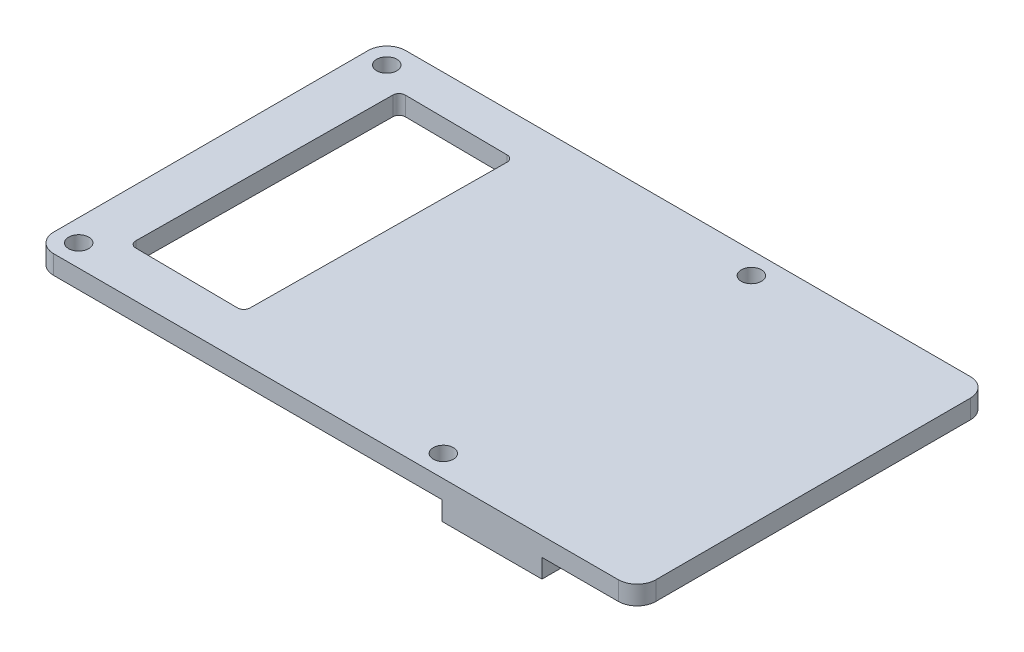
ISO-10303-21;
HEADER;
FILE_DESCRIPTION(('STEP AP214'),'2;1');
FILE_NAME('part.step','',(''),(''),'','','');
FILE_SCHEMA(('AUTOMOTIVE_DESIGN { 1 0 10303 214 1 1 1 1 }'));
ENDSEC;
DATA;
#1=APPLICATION_CONTEXT('core data for automotive mechanical design processes');
#2=APPLICATION_PROTOCOL_DEFINITION('international standard','automotive_design',2000,#1);
#3=PRODUCT_CONTEXT('',#1,'mechanical');
#4=PRODUCT('Part','Part','',(#3));
#5=PRODUCT_RELATED_PRODUCT_CATEGORY('part','',(#4));
#6=PRODUCT_DEFINITION_FORMATION('','',#4);
#7=PRODUCT_DEFINITION_CONTEXT('part definition',#1,'design');
#8=PRODUCT_DEFINITION('design','',#6,#7);
#9=PRODUCT_DEFINITION_SHAPE('','',#8);
#10=(LENGTH_UNIT() NAMED_UNIT(*) SI_UNIT(.MILLI.,.METRE.));
#11=(NAMED_UNIT(*) PLANE_ANGLE_UNIT() SI_UNIT($,.RADIAN.));
#12=(NAMED_UNIT(*) SI_UNIT($,.STERADIAN.) SOLID_ANGLE_UNIT());
#13=UNCERTAINTY_MEASURE_WITH_UNIT(LENGTH_MEASURE(1.E-05),#10,'distance_accuracy_value','');
#14=(GEOMETRIC_REPRESENTATION_CONTEXT(3) GLOBAL_UNCERTAINTY_ASSIGNED_CONTEXT((#13)) GLOBAL_UNIT_ASSIGNED_CONTEXT((#10,
#11,#12)) REPRESENTATION_CONTEXT('',''));
#15=CARTESIAN_POINT('',(0.,0.,0.));
#16=DIRECTION('',(0.,0.,1.));
#17=DIRECTION('',(1.,0.,0.));
#18=AXIS2_PLACEMENT_3D('',#15,#16,#17);
#19=CARTESIAN_POINT('',(-77.0217231267692,0.,-21.4026703774337));
#20=DIRECTION('',(0.,1.,0.));
#21=DIRECTION('',(0.,0.,1.));
#22=AXIS2_PLACEMENT_3D('',#19,#20,#21);
#23=PLANE('',#22);
#24=DIRECTION('',(0.,0.,-1.));
#25=VECTOR('',#24,1.);
#26=CARTESIAN_POINT('',(-15.2270796572365,0.,31.5917365313783));
#27=LINE('',#26,#25);
#28=CARTESIAN_POINT('',(-15.2270796572365,0.,31.5917365313783));
#29=VERTEX_POINT('',#28);
#30=CARTESIAN_POINT('',(-15.2270796572365,0.,-24.3899754320437));
#31=VERTEX_POINT('',#30);
#32=EDGE_CURVE('E202',#29,#31,#27,.T.);
#33=ORIENTED_EDGE('',*,*,#32,.F.);
#34=DIRECTION('',(1.,0.,0.));
#35=VECTOR('',#34,1.);
#36=CARTESIAN_POINT('',(-77.0217231267692,0.,31.5917365313783));
#37=LINE('',#36,#35);
#38=CARTESIAN_POINT('',(-77.0217231267692,0.,31.5917365313783));
#39=VERTEX_POINT('',#38);
#40=EDGE_CURVE('E367',#39,#29,#37,.T.);
#41=ORIENTED_EDGE('',*,*,#40,.F.);
#42=CARTESIAN_POINT('',(-77.0217231267692,0.,28.6044314767683));
#43=DIRECTION('',(0.,1.,0.));
#44=DIRECTION('',(0.,0.,1.));
#45=AXIS2_PLACEMENT_3D('',#42,#43,#44);
#46=CIRCLE('',#45,2.98730505460999);
#47=CARTESIAN_POINT('',(-80.0090281813792,0.,28.6044314767683));
#48=VERTEX_POINT('',#47);
#49=EDGE_CURVE('E364',#48,#39,#46,.T.);
#50=ORIENTED_EDGE('',*,*,#49,.F.);
#51=DIRECTION('',(0.,0.,1.));
#52=VECTOR('',#51,1.);
#53=CARTESIAN_POINT('',(-80.0090281813792,0.,-21.4026703774337));
#54=LINE('',#53,#52);
#55=CARTESIAN_POINT('',(-80.0090281813792,0.,-21.4026703774337));
#56=VERTEX_POINT('',#55);
#57=EDGE_CURVE('E362',#56,#48,#54,.T.);
#58=ORIENTED_EDGE('',*,*,#57,.F.);
#59=CARTESIAN_POINT('',(-77.0217231267692,0.,-21.4026703774337));
#60=DIRECTION('',(0.,1.,0.));
#61=DIRECTION('',(0.,0.,1.));
#62=AXIS2_PLACEMENT_3D('',#59,#60,#61);
#63=CIRCLE('',#62,2.98730505461);
#64=CARTESIAN_POINT('',(-77.0217231267692,0.,-24.3899754320437));
#65=VERTEX_POINT('',#64);
#66=EDGE_CURVE('E338',#65,#56,#63,.T.);
#67=ORIENTED_EDGE('',*,*,#66,.F.);
#68=DIRECTION('',(-1.,0.,0.));
#69=VECTOR('',#68,1.);
#70=CARTESIAN_POINT('',(12.7872583311938,0.,-24.3899754320437));
#71=LINE('',#70,#69);
#72=EDGE_CURVE('E376',#31,#65,#71,.T.);
#73=ORIENTED_EDGE('',*,*,#72,.F.);
#74=EDGE_LOOP('',(#33,#41,#50,#58,#67,#73));
#75=FACE_BOUND('',#74,.T.);
#76=CARTESIAN_POINT('',(-76.5283322199792,0.,28.1135297749583));
#77=DIRECTION('',(0.,1.,0.));
#78=DIRECTION('',(0.,0.,1.));
#79=AXIS2_PLACEMENT_3D('',#76,#77,#78);
#80=CIRCLE('',#79,1.6);
#81=CARTESIAN_POINT('',(-76.5283322199792,0.,29.7135297749583));
#82=VERTEX_POINT('',#81);
#83=EDGE_CURVE('E316',#82,#82,#80,.T.);
#84=ORIENTED_EDGE('',*,*,#83,.T.);
#85=EDGE_LOOP('',(#84));
#86=FACE_BOUND('',#85,.T.);
#87=CARTESIAN_POINT('',(-18.5283322199872,0.,28.1136567752183));
#88=DIRECTION('',(0.,1.,0.));
#89=DIRECTION('',(0.,0.,1.));
#90=AXIS2_PLACEMENT_3D('',#87,#88,#89);
#91=CIRCLE('',#90,1.6);
#92=CARTESIAN_POINT('',(-18.5283322199872,0.,29.7136567752183));
#93=VERTEX_POINT('',#92);
#94=EDGE_CURVE('E320',#93,#93,#91,.T.);
#95=ORIENTED_EDGE('',*,*,#94,.T.);
#96=EDGE_LOOP('',(#95));
#97=FACE_BOUND('',#96,.T.);
#98=CARTESIAN_POINT('',(-18.5285862204952,0.,-20.8865972252877));
#99=DIRECTION('',(0.,1.,0.));
#100=DIRECTION('',(0.,0.,1.));
#101=AXIS2_PLACEMENT_3D('',#98,#99,#100);
#102=CIRCLE('',#101,1.6);
#103=CARTESIAN_POINT('',(-18.5285862204952,0.,-19.2865972252877));
#104=VERTEX_POINT('',#103);
#105=EDGE_CURVE('E326',#104,#104,#102,.T.);
#106=ORIENTED_EDGE('',*,*,#105,.T.);
#107=EDGE_LOOP('',(#106));
#108=FACE_BOUND('',#107,.T.);
#109=CARTESIAN_POINT('',(-76.5284846202892,0.,-20.8867242255417));
#110=DIRECTION('',(0.,1.,0.));
#111=DIRECTION('',(0.,0.,1.));
#112=AXIS2_PLACEMENT_3D('',#109,#110,#111);
#113=CIRCLE('',#112,1.6);
#114=CARTESIAN_POINT('',(-76.5284846202892,0.,-19.2867242255417));
#115=VERTEX_POINT('',#114);
#116=EDGE_CURVE('E332',#115,#115,#113,.T.);
#117=ORIENTED_EDGE('',*,*,#116,.T.);
#118=EDGE_LOOP('',(#117));
#119=FACE_BOUND('',#118,.T.);
#120=CARTESIAN_POINT('',(-71.2794395148774,0.,23.2884633232575));
#121=DIRECTION('',(0.,1.,0.));
#122=DIRECTION('',(0.,0.,-1.));
#123=AXIS2_PLACEMENT_3D('',#120,#121,#122);
#124=CIRCLE('',#123,1.);
#125=CARTESIAN_POINT('',(-72.2793985022264,0.,23.2794066340148));
#126=VERTEX_POINT('',#125);
#127=CARTESIAN_POINT('',(-71.2884962041201,0.,24.2884223106065));
#128=VERTEX_POINT('',#127);
#129=EDGE_CURVE('E257',#126,#128,#124,.T.);
#130=ORIENTED_EDGE('',*,*,#129,.T.);
#131=DIRECTION('',(0.999958987348962,0.,0.00905668924269613));
#132=VECTOR('',#131,1.);
#133=CARTESIAN_POINT('',(-54.9495846601127,0.,24.4364048241797));
#134=LINE('',#133,#132);
#135=CARTESIAN_POINT('',(-54.9495846601127,0.,24.4364048241797));
#136=VERTEX_POINT('',#135);
#137=EDGE_CURVE('E279',#128,#136,#134,.T.);
#138=ORIENTED_EDGE('',*,*,#137,.T.);
#139=CARTESIAN_POINT('',(-54.94052797087,0.,23.4364458368307));
#140=DIRECTION('',(0.,1.,0.));
#141=DIRECTION('',(0.,0.,-1.));
#142=AXIS2_PLACEMENT_3D('',#139,#140,#141);
#143=CIRCLE('',#142,1.);
#144=CARTESIAN_POINT('',(-53.940568983521,0.,23.4455025260734));
#145=VERTEX_POINT('',#144);
#146=EDGE_CURVE('E282',#136,#145,#143,.T.);
#147=ORIENTED_EDGE('',*,*,#146,.T.);
#148=DIRECTION('',(0.00905668924269597,0.,-0.999958987348962));
#149=VECTOR('',#148,1.);
#150=CARTESIAN_POINT('',(-53.5735878673821,0.,-17.0732847963952));
#151=LINE('',#150,#149);
#152=CARTESIAN_POINT('',(-53.5735878673821,0.,-17.0732847963952));
#153=VERTEX_POINT('',#152);
#154=EDGE_CURVE('E285',#145,#153,#151,.T.);
#155=ORIENTED_EDGE('',*,*,#154,.T.);
#156=CARTESIAN_POINT('',(-54.573546854731,0.,-17.0823414856379));
#157=DIRECTION('',(0.,1.,0.));
#158=DIRECTION('',(0.,0.,1.));
#159=AXIS2_PLACEMENT_3D('',#156,#157,#158);
#160=CIRCLE('',#159,1.);
#161=CARTESIAN_POINT('',(-54.5644901654883,0.,-18.0823004729869));
#162=VERTEX_POINT('',#161);
#163=EDGE_CURVE('E288',#153,#162,#160,.T.);
#164=ORIENTED_EDGE('',*,*,#163,.T.);
#165=DIRECTION('',(-0.999958987348962,0.,-0.00905668924269613));
#166=VECTOR('',#165,1.);
#167=CARTESIAN_POINT('',(-70.9034017094957,0.,-18.2302829865601));
#168=LINE('',#167,#166);
#169=CARTESIAN_POINT('',(-70.9034017094957,0.,-18.2302829865601));
#170=VERTEX_POINT('',#169);
#171=EDGE_CURVE('E291',#162,#170,#168,.T.);
#172=ORIENTED_EDGE('',*,*,#171,.T.);
#173=CARTESIAN_POINT('',(-70.9124583987385,0.,-17.2303239992111));
#174=DIRECTION('',(0.,1.,0.));
#175=DIRECTION('',(0.,0.,1.));
#176=AXIS2_PLACEMENT_3D('',#173,#174,#175);
#177=CIRCLE('',#176,1.);
#178=CARTESIAN_POINT('',(-71.9124173860874,0.,-17.2393806884538));
#179=VERTEX_POINT('',#178);
#180=EDGE_CURVE('E294',#170,#179,#177,.T.);
#181=ORIENTED_EDGE('',*,*,#180,.T.);
#182=DIRECTION('',(-0.00905668924269614,0.,0.999958987348962));
#183=VECTOR('',#182,1.);
#184=CARTESIAN_POINT('',(-71.9124173860874,0.,-17.2393806884538));
#185=LINE('',#184,#183);
#186=EDGE_CURVE('E261',#179,#126,#185,.T.);
#187=ORIENTED_EDGE('',*,*,#186,.T.);
#188=EDGE_LOOP('',(#130,#138,#147,#155,#164,#172,#181,#187));
#189=FACE_BOUND('',#188,.T.);
#190=DIRECTION('',(0.,0.,-1.));
#191=VECTOR('',#190,1.);
#192=CARTESIAN_POINT('',(-36.8658082511568,0.,-15.5140581594289));
#193=LINE('',#192,#191);
#194=CARTESIAN_POINT('',(-36.8658082511568,0.,23.3522240061959));
#195=VERTEX_POINT('',#194);
#196=CARTESIAN_POINT('',(-36.8658082511568,0.,-15.5140581594289));
#197=VERTEX_POINT('',#196);
#198=EDGE_CURVE('E196',#195,#197,#193,.T.);
#199=ORIENTED_EDGE('',*,*,#198,.F.);
#200=DIRECTION('',(-1.,0.,0.));
#201=VECTOR('',#200,1.);
#202=CARTESIAN_POINT('',(-36.8658082511568,0.,23.3522240061959));
#203=LINE('',#202,#201);
#204=CARTESIAN_POINT('',(-24.844103821422,0.,23.3522240061959));
#205=VERTEX_POINT('',#204);
#206=EDGE_CURVE('E198',#205,#195,#203,.T.);
#207=ORIENTED_EDGE('',*,*,#206,.F.);
#208=DIRECTION('',(0.,0.,1.));
#209=VECTOR('',#208,1.);
#210=CARTESIAN_POINT('',(-24.844103821422,0.,-15.5140581594289));
#211=LINE('',#210,#209);
#212=CARTESIAN_POINT('',(-24.844103821422,0.,-15.5140581594289));
#213=VERTEX_POINT('',#212);
#214=EDGE_CURVE('E59',#213,#205,#211,.T.);
#215=ORIENTED_EDGE('',*,*,#214,.F.);
#216=DIRECTION('',(1.,0.,0.));
#217=VECTOR('',#216,1.);
#218=CARTESIAN_POINT('',(-36.8658082511568,0.,-15.5140581594289));
#219=LINE('',#218,#217);
#220=EDGE_CURVE('E54',#197,#213,#219,.T.);
#221=ORIENTED_EDGE('',*,*,#220,.F.);
#222=EDGE_LOOP('',(#199,#207,#215,#221));
#223=FACE_BOUND('',#222,.T.);
#224=ADVANCED_FACE('F39',(#75,#86,#97,#108,#119,#189,#223),#23,.F.);
#225=DIRECTION('',(0.,0.,1.));
#226=VECTOR('',#225,1.);
#227=CARTESIAN_POINT('',(0.63931518556087,0.,31.5917365313783));
#228=LINE('',#227,#226);
#229=CARTESIAN_POINT('',(0.639315185560874,0.,-24.3899754320437));
#230=VERTEX_POINT('',#229);
#231=CARTESIAN_POINT('',(0.63931518556087,0.,31.5917365313783));
#232=VERTEX_POINT('',#231);
#233=EDGE_CURVE('E235',#230,#232,#228,.T.);
#234=ORIENTED_EDGE('',*,*,#233,.F.);
#235=CARTESIAN_POINT('',(12.7872583311938,0.,-24.3899754320437));
#236=VERTEX_POINT('',#235);
#237=EDGE_CURVE('E345',#236,#230,#71,.T.);
#238=ORIENTED_EDGE('',*,*,#237,.F.);
#239=CARTESIAN_POINT('',(12.7872583311938,0.,-21.4026703774337));
#240=DIRECTION('',(0.,1.,0.));
#241=DIRECTION('',(0.,0.,1.));
#242=AXIS2_PLACEMENT_3D('',#239,#240,#241);
#243=CIRCLE('',#242,2.98730505461001);
#244=CARTESIAN_POINT('',(15.7745633858038,0.,-21.4026703774337));
#245=VERTEX_POINT('',#244);
#246=EDGE_CURVE('E374',#245,#236,#243,.T.);
#247=ORIENTED_EDGE('',*,*,#246,.F.);
#248=DIRECTION('',(0.,0.,-1.));
#249=VECTOR('',#248,1.);
#250=CARTESIAN_POINT('',(15.7745633858038,0.,28.6044314767683));
#251=LINE('',#250,#249);
#252=CARTESIAN_POINT('',(15.7745633858038,0.,28.6044314767683));
#253=VERTEX_POINT('',#252);
#254=EDGE_CURVE('E372',#253,#245,#251,.T.);
#255=ORIENTED_EDGE('',*,*,#254,.F.);
#256=CARTESIAN_POINT('',(12.7872583311938,0.,28.6044314767683));
#257=DIRECTION('',(0.,1.,0.));
#258=DIRECTION('',(0.,0.,1.));
#259=AXIS2_PLACEMENT_3D('',#256,#257,#258);
#260=CIRCLE('',#259,2.98730505461);
#261=CARTESIAN_POINT('',(12.7872583311938,0.,31.5917365313783));
#262=VERTEX_POINT('',#261);
#263=EDGE_CURVE('E370',#262,#253,#260,.T.);
#264=ORIENTED_EDGE('',*,*,#263,.F.);
#265=EDGE_CURVE('E366',#232,#262,#37,.T.);
#266=ORIENTED_EDGE('',*,*,#265,.F.);
#267=EDGE_LOOP('',(#234,#238,#247,#255,#264,#266));
#268=FACE_BOUND('',#267,.T.);
#269=ADVANCED_FACE('F426',(#268),#23,.F.);
#270=CARTESIAN_POINT('',(-77.0217231267692,3.,-21.4026703774337));
#271=DIRECTION('',(0.,1.,0.));
#272=DIRECTION('',(0.,0.,1.));
#273=AXIS2_PLACEMENT_3D('',#270,#271,#272);
#274=PLANE('',#273);
#275=CARTESIAN_POINT('',(-18.5283322199872,3.,28.1136567752183));
#276=DIRECTION('',(0.,1.,0.));
#277=DIRECTION('',(0.,0.,1.));
#278=AXIS2_PLACEMENT_3D('',#275,#276,#277);
#279=CIRCLE('',#278,1.6);
#280=CARTESIAN_POINT('',(-18.5283322199872,3.,29.7136567752183));
#281=VERTEX_POINT('',#280);
#282=EDGE_CURVE('E323',#281,#281,#279,.T.);
#283=ORIENTED_EDGE('',*,*,#282,.F.);
#284=EDGE_LOOP('',(#283));
#285=FACE_BOUND('',#284,.T.);
#286=CARTESIAN_POINT('',(-76.5284846202892,3.,-20.8867242255417));
#287=DIRECTION('',(0.,1.,0.));
#288=DIRECTION('',(0.,0.,1.));
#289=AXIS2_PLACEMENT_3D('',#286,#287,#288);
#290=CIRCLE('',#289,1.6);
#291=CARTESIAN_POINT('',(-76.5284846202892,3.,-19.2867242255417));
#292=VERTEX_POINT('',#291);
#293=EDGE_CURVE('E335',#292,#292,#290,.T.);
#294=ORIENTED_EDGE('',*,*,#293,.F.);
#295=EDGE_LOOP('',(#294));
#296=FACE_BOUND('',#295,.T.);
#297=CARTESIAN_POINT('',(-77.0217231267692,3.,-21.4026703774337));
#298=DIRECTION('',(0.,1.,0.));
#299=DIRECTION('',(0.,0.,1.));
#300=AXIS2_PLACEMENT_3D('',#297,#298,#299);
#301=CIRCLE('',#300,2.98730505461);
#302=CARTESIAN_POINT('',(-77.0217231267692,3.,-24.3899754320437));
#303=VERTEX_POINT('',#302);
#304=CARTESIAN_POINT('',(-80.0090281813792,3.,-21.4026703774337));
#305=VERTEX_POINT('',#304);
#306=EDGE_CURVE('E341',#303,#305,#301,.T.);
#307=ORIENTED_EDGE('',*,*,#306,.T.);
#308=DIRECTION('',(0.,0.,1.));
#309=VECTOR('',#308,1.);
#310=CARTESIAN_POINT('',(-80.0090281813792,3.,-21.4026703774337));
#311=LINE('',#310,#309);
#312=CARTESIAN_POINT('',(-80.0090281813792,3.,28.6044314767683));
#313=VERTEX_POINT('',#312);
#314=EDGE_CURVE('E344',#305,#313,#311,.T.);
#315=ORIENTED_EDGE('',*,*,#314,.T.);
#316=CARTESIAN_POINT('',(-77.0217231267692,3.,28.6044314767683));
#317=DIRECTION('',(0.,1.,0.));
#318=DIRECTION('',(0.,0.,1.));
#319=AXIS2_PLACEMENT_3D('',#316,#317,#318);
#320=CIRCLE('',#319,2.98730505460999);
#321=CARTESIAN_POINT('',(-77.0217231267692,3.,31.5917365313783));
#322=VERTEX_POINT('',#321);
#323=EDGE_CURVE('E347',#313,#322,#320,.T.);
#324=ORIENTED_EDGE('',*,*,#323,.T.);
#325=DIRECTION('',(1.,0.,0.));
#326=VECTOR('',#325,1.);
#327=CARTESIAN_POINT('',(-77.0217231267692,3.,31.5917365313783));
#328=LINE('',#327,#326);
#329=CARTESIAN_POINT('',(12.7872583311938,3.,31.5917365313783));
#330=VERTEX_POINT('',#329);
#331=EDGE_CURVE('E349',#322,#330,#328,.T.);
#332=ORIENTED_EDGE('',*,*,#331,.T.);
#333=CARTESIAN_POINT('',(12.7872583311938,3.,28.6044314767683));
#334=DIRECTION('',(0.,1.,0.));
#335=DIRECTION('',(0.,0.,1.));
#336=AXIS2_PLACEMENT_3D('',#333,#334,#335);
#337=CIRCLE('',#336,2.98730505461);
#338=CARTESIAN_POINT('',(15.7745633858038,3.,28.6044314767683));
#339=VERTEX_POINT('',#338);
#340=EDGE_CURVE('E351',#330,#339,#337,.T.);
#341=ORIENTED_EDGE('',*,*,#340,.T.);
#342=DIRECTION('',(0.,0.,-1.));
#343=VECTOR('',#342,1.);
#344=CARTESIAN_POINT('',(15.7745633858038,3.,28.6044314767683));
#345=LINE('',#344,#343);
#346=CARTESIAN_POINT('',(15.7745633858038,3.,-21.4026703774337));
#347=VERTEX_POINT('',#346);
#348=EDGE_CURVE('E353',#339,#347,#345,.T.);
#349=ORIENTED_EDGE('',*,*,#348,.T.);
#350=CARTESIAN_POINT('',(12.7872583311938,3.,-21.4026703774337));
#351=DIRECTION('',(0.,1.,0.));
#352=DIRECTION('',(0.,0.,1.));
#353=AXIS2_PLACEMENT_3D('',#350,#351,#352);
#354=CIRCLE('',#353,2.98730505461001);
#355=CARTESIAN_POINT('',(12.7872583311938,3.,-24.3899754320437));
#356=VERTEX_POINT('',#355);
#357=EDGE_CURVE('E355',#347,#356,#354,.T.);
#358=ORIENTED_EDGE('',*,*,#357,.T.);
#359=DIRECTION('',(-1.,0.,0.));
#360=VECTOR('',#359,1.);
#361=CARTESIAN_POINT('',(12.7872583311938,3.,-24.3899754320437));
#362=LINE('',#361,#360);
#363=EDGE_CURVE('E357',#356,#303,#362,.T.);
#364=ORIENTED_EDGE('',*,*,#363,.T.);
#365=EDGE_LOOP('',(#307,#315,#324,#332,#341,#349,#358,#364));
#366=FACE_BOUND('',#365,.T.);
#367=CARTESIAN_POINT('',(-18.5285862204952,3.,-20.8865972252877));
#368=DIRECTION('',(0.,1.,0.));
#369=DIRECTION('',(0.,0.,1.));
#370=AXIS2_PLACEMENT_3D('',#367,#368,#369);
#371=CIRCLE('',#370,1.6);
#372=CARTESIAN_POINT('',(-18.5285862204952,3.,-19.2865972252877));
#373=VERTEX_POINT('',#372);
#374=EDGE_CURVE('E329',#373,#373,#371,.T.);
#375=ORIENTED_EDGE('',*,*,#374,.F.);
#376=EDGE_LOOP('',(#375));
#377=FACE_BOUND('',#376,.T.);
#378=CARTESIAN_POINT('',(-76.5283322199792,3.,28.1135297749583));
#379=DIRECTION('',(0.,1.,0.));
#380=DIRECTION('',(0.,0.,1.));
#381=AXIS2_PLACEMENT_3D('',#378,#379,#380);
#382=CIRCLE('',#381,1.6);
#383=CARTESIAN_POINT('',(-76.5283322199792,3.,29.7135297749583));
#384=VERTEX_POINT('',#383);
#385=EDGE_CURVE('E317',#384,#384,#382,.T.);
#386=ORIENTED_EDGE('',*,*,#385,.F.);
#387=EDGE_LOOP('',(#386));
#388=FACE_BOUND('',#387,.T.);
#389=DIRECTION('',(0.999958987348962,0.,0.00905668924269613));
#390=VECTOR('',#389,1.);
#391=CARTESIAN_POINT('',(-54.9495846601127,3.,24.4364048241797));
#392=LINE('',#391,#390);
#393=CARTESIAN_POINT('',(-71.2884962041201,3.,24.2884223106065));
#394=VERTEX_POINT('',#393);
#395=CARTESIAN_POINT('',(-54.9495846601127,3.,24.4364048241797));
#396=VERTEX_POINT('',#395);
#397=EDGE_CURVE('E260',#394,#396,#392,.T.);
#398=ORIENTED_EDGE('',*,*,#397,.F.);
#399=CARTESIAN_POINT('',(-71.2794395148774,3.,23.2884633232575));
#400=DIRECTION('',(0.,1.,0.));
#401=DIRECTION('',(0.,0.,-1.));
#402=AXIS2_PLACEMENT_3D('',#399,#400,#401);
#403=CIRCLE('',#402,1.);
#404=CARTESIAN_POINT('',(-72.2793985022264,3.,23.2794066340148));
#405=VERTEX_POINT('',#404);
#406=EDGE_CURVE('E258',#405,#394,#403,.T.);
#407=ORIENTED_EDGE('',*,*,#406,.F.);
#408=DIRECTION('',(-0.00905668924269614,0.,0.999958987348962));
#409=VECTOR('',#408,1.);
#410=CARTESIAN_POINT('',(-71.9124173860874,3.,-17.2393806884538));
#411=LINE('',#410,#409);
#412=CARTESIAN_POINT('',(-71.9124173860874,3.,-17.2393806884538));
#413=VERTEX_POINT('',#412);
#414=EDGE_CURVE('E274',#413,#405,#411,.T.);
#415=ORIENTED_EDGE('',*,*,#414,.F.);
#416=CARTESIAN_POINT('',(-70.9124583987385,3.,-17.2303239992111));
#417=DIRECTION('',(0.,1.,0.));
#418=DIRECTION('',(0.,0.,1.));
#419=AXIS2_PLACEMENT_3D('',#416,#417,#418);
#420=CIRCLE('',#419,1.);
#421=CARTESIAN_POINT('',(-70.9034017094957,3.,-18.2302829865601));
#422=VERTEX_POINT('',#421);
#423=EDGE_CURVE('E271',#422,#413,#420,.T.);
#424=ORIENTED_EDGE('',*,*,#423,.F.);
#425=DIRECTION('',(-0.999958987348962,0.,-0.00905668924269613));
#426=VECTOR('',#425,1.);
#427=CARTESIAN_POINT('',(-70.9034017094957,3.,-18.2302829865601));
#428=LINE('',#427,#426);
#429=CARTESIAN_POINT('',(-54.5644901654883,3.,-18.0823004729869));
#430=VERTEX_POINT('',#429);
#431=EDGE_CURVE('E269',#430,#422,#428,.T.);
#432=ORIENTED_EDGE('',*,*,#431,.F.);
#433=CARTESIAN_POINT('',(-54.573546854731,3.,-17.0823414856379));
#434=DIRECTION('',(0.,1.,0.));
#435=DIRECTION('',(0.,0.,1.));
#436=AXIS2_PLACEMENT_3D('',#433,#434,#435);
#437=CIRCLE('',#436,1.);
#438=CARTESIAN_POINT('',(-53.5735878673821,3.,-17.0732847963952));
#439=VERTEX_POINT('',#438);
#440=EDGE_CURVE('E267',#439,#430,#437,.T.);
#441=ORIENTED_EDGE('',*,*,#440,.F.);
#442=DIRECTION('',(0.00905668924269597,0.,-0.999958987348962));
#443=VECTOR('',#442,1.);
#444=CARTESIAN_POINT('',(-53.5735878673821,3.,-17.0732847963952));
#445=LINE('',#444,#443);
#446=CARTESIAN_POINT('',(-53.940568983521,3.,23.4455025260734));
#447=VERTEX_POINT('',#446);
#448=EDGE_CURVE('E265',#447,#439,#445,.T.);
#449=ORIENTED_EDGE('',*,*,#448,.F.);
#450=CARTESIAN_POINT('',(-54.94052797087,3.,23.4364458368307));
#451=DIRECTION('',(0.,1.,0.));
#452=DIRECTION('',(0.,0.,-1.));
#453=AXIS2_PLACEMENT_3D('',#450,#451,#452);
#454=CIRCLE('',#453,1.);
#455=EDGE_CURVE('E263',#396,#447,#454,.T.);
#456=ORIENTED_EDGE('',*,*,#455,.F.);
#457=EDGE_LOOP('',(#398,#407,#415,#424,#432,#441,#449,#456));
#458=FACE_BOUND('',#457,.T.);
#459=ADVANCED_FACE('F447',(#285,#296,#366,#377,#388,#458),#274,.T.);
#460=CARTESIAN_POINT('',(-77.0217231267692,3.,-21.4026703774337));
#461=DIRECTION('',(0.,-1.,0.));
#462=DIRECTION('',(0.,0.,-1.));
#463=AXIS2_PLACEMENT_3D('',#460,#461,#462);
#464=CYLINDRICAL_SURFACE('',#463,2.98730505461);
#465=ORIENTED_EDGE('',*,*,#66,.T.);
#466=DIRECTION('',(0.,-1.,0.));
#467=VECTOR('',#466,1.);
#468=CARTESIAN_POINT('',(-80.0090281813792,3.,-21.4026703774337));
#469=LINE('',#468,#467);
#470=EDGE_CURVE('E11',#305,#56,#469,.T.);
#471=ORIENTED_EDGE('',*,*,#470,.F.);
#472=ORIENTED_EDGE('',*,*,#306,.F.);
#473=DIRECTION('',(0.,-1.,0.));
#474=VECTOR('',#473,1.);
#475=CARTESIAN_POINT('',(-77.0217231267692,3.,-24.3899754320437));
#476=LINE('',#475,#474);
#477=EDGE_CURVE('E359',#303,#65,#476,.T.);
#478=ORIENTED_EDGE('',*,*,#477,.T.);
#479=EDGE_LOOP('',(#465,#471,#472,#478));
#480=FACE_BOUND('',#479,.T.);
#481=ADVANCED_FACE('F41',(#480),#464,.T.);
#482=CARTESIAN_POINT('',(-80.0090281813792,3.,-21.4026703774337));
#483=DIRECTION('',(1.,0.,0.));
#484=DIRECTION('',(0.,0.,-1.));
#485=AXIS2_PLACEMENT_3D('',#482,#483,#484);
#486=PLANE('',#485);
#487=ORIENTED_EDGE('',*,*,#57,.T.);
#488=DIRECTION('',(0.,-1.,0.));
#489=VECTOR('',#488,1.);
#490=CARTESIAN_POINT('',(-80.0090281813792,3.,28.6044314767683));
#491=LINE('',#490,#489);
#492=EDGE_CURVE('E47',#313,#48,#491,.T.);
#493=ORIENTED_EDGE('',*,*,#492,.F.);
#494=ORIENTED_EDGE('',*,*,#314,.F.);
#495=ORIENTED_EDGE('',*,*,#470,.T.);
#496=EDGE_LOOP('',(#487,#493,#494,#495));
#497=FACE_BOUND('',#496,.T.);
#498=ADVANCED_FACE('F451',(#497),#486,.F.);
#499=CARTESIAN_POINT('',(-77.0217231267692,3.,28.6044314767683));
#500=DIRECTION('',(0.,-1.,0.));
#501=DIRECTION('',(0.,0.,-1.));
#502=AXIS2_PLACEMENT_3D('',#499,#500,#501);
#503=CYLINDRICAL_SURFACE('',#502,2.98730505460999);
#504=ORIENTED_EDGE('',*,*,#49,.T.);
#505=DIRECTION('',(0.,-1.,0.));
#506=VECTOR('',#505,1.);
#507=CARTESIAN_POINT('',(-77.0217231267692,3.,31.5917365313783));
#508=LINE('',#507,#506);
#509=EDGE_CURVE('E393',#322,#39,#508,.T.);
#510=ORIENTED_EDGE('',*,*,#509,.F.);
#511=ORIENTED_EDGE('',*,*,#323,.F.);
#512=ORIENTED_EDGE('',*,*,#492,.T.);
#513=EDGE_LOOP('',(#504,#510,#511,#512));
#514=FACE_BOUND('',#513,.T.);
#515=ADVANCED_FACE('F400',(#514),#503,.T.);
#516=CARTESIAN_POINT('',(-77.0217231267692,3.,31.5917365313783));
#517=DIRECTION('',(0.,0.,-1.));
#518=DIRECTION('',(-1.,0.,0.));
#519=AXIS2_PLACEMENT_3D('',#516,#517,#518);
#520=PLANE('',#519);
#521=ORIENTED_EDGE('',*,*,#40,.T.);
#522=DIRECTION('',(0.,1.,0.));
#523=VECTOR('',#522,1.);
#524=CARTESIAN_POINT('',(-15.2270796572365,-3.,31.5917365313783));
#525=LINE('',#524,#523);
#526=CARTESIAN_POINT('',(-15.2270796572365,-3.,31.5917365313783));
#527=VERTEX_POINT('',#526);
#528=EDGE_CURVE('E241',#527,#29,#525,.T.);
#529=ORIENTED_EDGE('',*,*,#528,.F.);
#530=DIRECTION('',(-1.,0.,0.));
#531=VECTOR('',#530,1.);
#532=CARTESIAN_POINT('',(-15.2270796572365,-3.,31.5917365313783));
#533=LINE('',#532,#531);
#534=CARTESIAN_POINT('',(0.63931518556087,-3.,31.5917365313783));
#535=VERTEX_POINT('',#534);
#536=EDGE_CURVE('E239',#535,#527,#533,.T.);
#537=ORIENTED_EDGE('',*,*,#536,.F.);
#538=DIRECTION('',(0.,1.,0.));
#539=VECTOR('',#538,1.);
#540=CARTESIAN_POINT('',(0.63931518556087,-3.,31.5917365313783));
#541=LINE('',#540,#539);
#542=EDGE_CURVE('E248',#535,#232,#541,.T.);
#543=ORIENTED_EDGE('',*,*,#542,.T.);
#544=ORIENTED_EDGE('',*,*,#265,.T.);
#545=DIRECTION('',(0.,-1.,0.));
#546=VECTOR('',#545,1.);
#547=CARTESIAN_POINT('',(12.7872583311938,3.,31.5917365313783));
#548=LINE('',#547,#546);
#549=EDGE_CURVE('E390',#330,#262,#548,.T.);
#550=ORIENTED_EDGE('',*,*,#549,.F.);
#551=ORIENTED_EDGE('',*,*,#331,.F.);
#552=ORIENTED_EDGE('',*,*,#509,.T.);
#553=EDGE_LOOP('',(#521,#529,#537,#543,#544,#550,#551,#552));
#554=FACE_BOUND('',#553,.T.);
#555=ADVANCED_FACE('F409',(#554),#520,.F.);
#556=CARTESIAN_POINT('',(12.7872583311938,3.,28.6044314767683));
#557=DIRECTION('',(0.,-1.,0.));
#558=DIRECTION('',(0.,0.,-1.));
#559=AXIS2_PLACEMENT_3D('',#556,#557,#558);
#560=CYLINDRICAL_SURFACE('',#559,2.98730505461);
#561=ORIENTED_EDGE('',*,*,#263,.T.);
#562=DIRECTION('',(0.,-1.,0.));
#563=VECTOR('',#562,1.);
#564=CARTESIAN_POINT('',(15.7745633858038,3.,28.6044314767683));
#565=LINE('',#564,#563);
#566=EDGE_CURVE('E387',#339,#253,#565,.T.);
#567=ORIENTED_EDGE('',*,*,#566,.F.);
#568=ORIENTED_EDGE('',*,*,#340,.F.);
#569=ORIENTED_EDGE('',*,*,#549,.T.);
#570=EDGE_LOOP('',(#561,#567,#568,#569));
#571=FACE_BOUND('',#570,.T.);
#572=ADVANCED_FACE('F445',(#571),#560,.T.);
#573=CARTESIAN_POINT('',(15.7745633858038,3.,28.6044314767683));
#574=DIRECTION('',(-1.,0.,0.));
#575=DIRECTION('',(0.,0.,1.));
#576=AXIS2_PLACEMENT_3D('',#573,#574,#575);
#577=PLANE('',#576);
#578=ORIENTED_EDGE('',*,*,#254,.T.);
#579=DIRECTION('',(0.,-1.,0.));
#580=VECTOR('',#579,1.);
#581=CARTESIAN_POINT('',(15.7745633858038,3.,-21.4026703774337));
#582=LINE('',#581,#580);
#583=EDGE_CURVE('E384',#347,#245,#582,.T.);
#584=ORIENTED_EDGE('',*,*,#583,.F.);
#585=ORIENTED_EDGE('',*,*,#348,.F.);
#586=ORIENTED_EDGE('',*,*,#566,.T.);
#587=EDGE_LOOP('',(#578,#584,#585,#586));
#588=FACE_BOUND('',#587,.T.);
#589=ADVANCED_FACE('F440',(#588),#577,.F.);
#590=CARTESIAN_POINT('',(12.7872583311938,3.,-21.4026703774337));
#591=DIRECTION('',(0.,-1.,0.));
#592=DIRECTION('',(0.,0.,-1.));
#593=AXIS2_PLACEMENT_3D('',#590,#591,#592);
#594=CYLINDRICAL_SURFACE('',#593,2.98730505461001);
#595=ORIENTED_EDGE('',*,*,#246,.T.);
#596=DIRECTION('',(0.,-1.,0.));
#597=VECTOR('',#596,1.);
#598=CARTESIAN_POINT('',(12.7872583311938,3.,-24.3899754320437));
#599=LINE('',#598,#597);
#600=EDGE_CURVE('E381',#356,#236,#599,.T.);
#601=ORIENTED_EDGE('',*,*,#600,.F.);
#602=ORIENTED_EDGE('',*,*,#357,.F.);
#603=ORIENTED_EDGE('',*,*,#583,.T.);
#604=EDGE_LOOP('',(#595,#601,#602,#603));
#605=FACE_BOUND('',#604,.T.);
#606=ADVANCED_FACE('F436',(#605),#594,.T.);
#607=CARTESIAN_POINT('',(12.7872583311938,3.,-24.3899754320437));
#608=DIRECTION('',(0.,0.,1.));
#609=DIRECTION('',(1.,0.,0.));
#610=AXIS2_PLACEMENT_3D('',#607,#608,#609);
#611=PLANE('',#610);
#612=ORIENTED_EDGE('',*,*,#237,.T.);
#613=DIRECTION('',(0.,1.,0.));
#614=VECTOR('',#613,1.);
#615=CARTESIAN_POINT('',(0.639315185560877,-3.,-24.3899754320437));
#616=LINE('',#615,#614);
#617=CARTESIAN_POINT('',(0.639315185560877,-3.,-24.3899754320437));
#618=VERTEX_POINT('',#617);
#619=EDGE_CURVE('E251',#618,#230,#616,.T.);
#620=ORIENTED_EDGE('',*,*,#619,.F.);
#621=DIRECTION('',(1.,0.,0.));
#622=VECTOR('',#621,1.);
#623=CARTESIAN_POINT('',(-15.2270796572365,-3.,-24.3899754320437));
#624=LINE('',#623,#622);
#625=CARTESIAN_POINT('',(-15.2270796572365,-3.,-24.3899754320437));
#626=VERTEX_POINT('',#625);
#627=EDGE_CURVE('E234',#626,#618,#624,.T.);
#628=ORIENTED_EDGE('',*,*,#627,.F.);
#629=DIRECTION('',(0.,1.,0.));
#630=VECTOR('',#629,1.);
#631=CARTESIAN_POINT('',(-15.2270796572365,-3.,-24.3899754320437));
#632=LINE('',#631,#630);
#633=EDGE_CURVE('E254',#626,#31,#632,.T.);
#634=ORIENTED_EDGE('',*,*,#633,.T.);
#635=ORIENTED_EDGE('',*,*,#72,.T.);
#636=ORIENTED_EDGE('',*,*,#477,.F.);
#637=ORIENTED_EDGE('',*,*,#363,.F.);
#638=ORIENTED_EDGE('',*,*,#600,.T.);
#639=EDGE_LOOP('',(#612,#620,#628,#634,#635,#636,#637,#638));
#640=FACE_BOUND('',#639,.T.);
#641=ADVANCED_FACE('F430',(#640),#611,.F.);
#642=CARTESIAN_POINT('',(-76.5284846202892,3.,-20.8867242255417));
#643=DIRECTION('',(0.,-1.,0.));
#644=DIRECTION('',(0.,0.,-1.));
#645=AXIS2_PLACEMENT_3D('',#642,#643,#644);
#646=CYLINDRICAL_SURFACE('',#645,1.6);
#647=ORIENTED_EDGE('',*,*,#293,.T.);
#648=EDGE_LOOP('',(#647));
#649=FACE_BOUND('',#648,.T.);
#650=ORIENTED_EDGE('',*,*,#116,.F.);
#651=EDGE_LOOP('',(#650));
#652=FACE_BOUND('',#651,.T.);
#653=ADVANCED_FACE('F469',(#649,#652),#646,.F.);
#654=CARTESIAN_POINT('',(-18.5285862204952,3.,-20.8865972252877));
#655=DIRECTION('',(0.,-1.,0.));
#656=DIRECTION('',(0.,0.,-1.));
#657=AXIS2_PLACEMENT_3D('',#654,#655,#656);
#658=CYLINDRICAL_SURFACE('',#657,1.6);
#659=ORIENTED_EDGE('',*,*,#374,.T.);
#660=EDGE_LOOP('',(#659));
#661=FACE_BOUND('',#660,.T.);
#662=ORIENTED_EDGE('',*,*,#105,.F.);
#663=EDGE_LOOP('',(#662));
#664=FACE_BOUND('',#663,.T.);
#665=ADVANCED_FACE('F511',(#661,#664),#658,.F.);
#666=CARTESIAN_POINT('',(-18.5283322199872,3.,28.1136567752183));
#667=DIRECTION('',(0.,-1.,0.));
#668=DIRECTION('',(0.,0.,-1.));
#669=AXIS2_PLACEMENT_3D('',#666,#667,#668);
#670=CYLINDRICAL_SURFACE('',#669,1.6);
#671=ORIENTED_EDGE('',*,*,#282,.T.);
#672=EDGE_LOOP('',(#671));
#673=FACE_BOUND('',#672,.T.);
#674=ORIENTED_EDGE('',*,*,#94,.F.);
#675=EDGE_LOOP('',(#674));
#676=FACE_BOUND('',#675,.T.);
#677=ADVANCED_FACE('F518',(#673,#676),#670,.F.);
#678=CARTESIAN_POINT('',(-76.5283322199792,3.,28.1135297749583));
#679=DIRECTION('',(0.,-1.,0.));
#680=DIRECTION('',(0.,0.,-1.));
#681=AXIS2_PLACEMENT_3D('',#678,#679,#680);
#682=CYLINDRICAL_SURFACE('',#681,1.6);
#683=ORIENTED_EDGE('',*,*,#385,.T.);
#684=EDGE_LOOP('',(#683));
#685=FACE_BOUND('',#684,.T.);
#686=ORIENTED_EDGE('',*,*,#83,.F.);
#687=EDGE_LOOP('',(#686));
#688=FACE_BOUND('',#687,.T.);
#689=ADVANCED_FACE('F526',(#685,#688),#682,.F.);
#690=CARTESIAN_POINT('',(-71.2794395148774,3.,23.2884633232575));
#691=DIRECTION('',(0.,-1.,0.));
#692=DIRECTION('',(0.,0.,-1.));
#693=AXIS2_PLACEMENT_3D('',#690,#691,#692);
#694=CYLINDRICAL_SURFACE('',#693,1.);
#695=ORIENTED_EDGE('',*,*,#129,.F.);
#696=DIRECTION('',(0.,-1.,0.));
#697=VECTOR('',#696,1.);
#698=CARTESIAN_POINT('',(-72.2793985022264,3.,23.2794066340148));
#699=LINE('',#698,#697);
#700=EDGE_CURVE('E276',#405,#126,#699,.T.);
#701=ORIENTED_EDGE('',*,*,#700,.F.);
#702=ORIENTED_EDGE('',*,*,#406,.T.);
#703=DIRECTION('',(0.,-1.,0.));
#704=VECTOR('',#703,1.);
#705=CARTESIAN_POINT('',(-71.2884962041201,3.,24.2884223106065));
#706=LINE('',#705,#704);
#707=EDGE_CURVE('E313',#394,#128,#706,.T.);
#708=ORIENTED_EDGE('',*,*,#707,.T.);
#709=EDGE_LOOP('',(#695,#701,#702,#708));
#710=FACE_BOUND('',#709,.T.);
#711=ADVANCED_FACE('F534',(#710),#694,.F.);
#712=CARTESIAN_POINT('',(-54.9495846601127,3.,24.4364048241797));
#713=DIRECTION('',(0.00905668924269612,0.,-0.999958987348962));
#714=DIRECTION('',(-0.999958987348962,0.,-0.00905668924269613));
#715=AXIS2_PLACEMENT_3D('',#712,#713,#714);
#716=PLANE('',#715);
#717=ORIENTED_EDGE('',*,*,#137,.F.);
#718=ORIENTED_EDGE('',*,*,#707,.F.);
#719=ORIENTED_EDGE('',*,*,#397,.T.);
#720=DIRECTION('',(0.,-1.,0.));
#721=VECTOR('',#720,1.);
#722=CARTESIAN_POINT('',(-54.9495846601127,3.,24.4364048241797));
#723=LINE('',#722,#721);
#724=EDGE_CURVE('E311',#396,#136,#723,.T.);
#725=ORIENTED_EDGE('',*,*,#724,.T.);
#726=EDGE_LOOP('',(#717,#718,#719,#725));
#727=FACE_BOUND('',#726,.T.);
#728=ADVANCED_FACE('F542',(#727),#716,.T.);
#729=CARTESIAN_POINT('',(-54.94052797087,3.,23.4364458368307));
#730=DIRECTION('',(0.,-1.,0.));
#731=DIRECTION('',(0.,0.,-1.));
#732=AXIS2_PLACEMENT_3D('',#729,#730,#731);
#733=CYLINDRICAL_SURFACE('',#732,1.);
#734=ORIENTED_EDGE('',*,*,#146,.F.);
#735=ORIENTED_EDGE('',*,*,#724,.F.);
#736=ORIENTED_EDGE('',*,*,#455,.T.);
#737=DIRECTION('',(0.,-1.,0.));
#738=VECTOR('',#737,1.);
#739=CARTESIAN_POINT('',(-53.940568983521,3.,23.4455025260734));
#740=LINE('',#739,#738);
#741=EDGE_CURVE('E309',#447,#145,#740,.T.);
#742=ORIENTED_EDGE('',*,*,#741,.T.);
#743=EDGE_LOOP('',(#734,#735,#736,#742));
#744=FACE_BOUND('',#743,.T.);
#745=ADVANCED_FACE('F550',(#744),#733,.F.);
#746=CARTESIAN_POINT('',(-53.5735878673821,3.,-17.0732847963952));
#747=DIRECTION('',(-0.999958987348962,0.,-0.00905668924269597));
#748=DIRECTION('',(-0.00905668924269597,0.,0.999958987348962));
#749=AXIS2_PLACEMENT_3D('',#746,#747,#748);
#750=PLANE('',#749);
#751=ORIENTED_EDGE('',*,*,#154,.F.);
#752=ORIENTED_EDGE('',*,*,#741,.F.);
#753=ORIENTED_EDGE('',*,*,#448,.T.);
#754=DIRECTION('',(0.,-1.,0.));
#755=VECTOR('',#754,1.);
#756=CARTESIAN_POINT('',(-53.5735878673821,3.,-17.0732847963952));
#757=LINE('',#756,#755);
#758=EDGE_CURVE('E307',#439,#153,#757,.T.);
#759=ORIENTED_EDGE('',*,*,#758,.T.);
#760=EDGE_LOOP('',(#751,#752,#753,#759));
#761=FACE_BOUND('',#760,.T.);
#762=ADVANCED_FACE('F558',(#761),#750,.T.);
#763=CARTESIAN_POINT('',(-54.573546854731,3.,-17.0823414856379));
#764=DIRECTION('',(0.,-1.,0.));
#765=DIRECTION('',(0.,0.,-1.));
#766=AXIS2_PLACEMENT_3D('',#763,#764,#765);
#767=CYLINDRICAL_SURFACE('',#766,1.);
#768=ORIENTED_EDGE('',*,*,#163,.F.);
#769=ORIENTED_EDGE('',*,*,#758,.F.);
#770=ORIENTED_EDGE('',*,*,#440,.T.);
#771=DIRECTION('',(0.,-1.,0.));
#772=VECTOR('',#771,1.);
#773=CARTESIAN_POINT('',(-54.5644901654883,3.,-18.0823004729869));
#774=LINE('',#773,#772);
#775=EDGE_CURVE('E305',#430,#162,#774,.T.);
#776=ORIENTED_EDGE('',*,*,#775,.T.);
#777=EDGE_LOOP('',(#768,#769,#770,#776));
#778=FACE_BOUND('',#777,.T.);
#779=ADVANCED_FACE('F566',(#778),#767,.F.);
#780=CARTESIAN_POINT('',(-70.9034017094957,3.,-18.2302829865601));
#781=DIRECTION('',(-0.00905668924269613,0.,0.999958987348962));
#782=DIRECTION('',(0.999958987348962,0.,0.00905668924269613));
#783=AXIS2_PLACEMENT_3D('',#780,#781,#782);
#784=PLANE('',#783);
#785=ORIENTED_EDGE('',*,*,#171,.F.);
#786=ORIENTED_EDGE('',*,*,#775,.F.);
#787=ORIENTED_EDGE('',*,*,#431,.T.);
#788=DIRECTION('',(0.,-1.,0.));
#789=VECTOR('',#788,1.);
#790=CARTESIAN_POINT('',(-70.9034017094957,3.,-18.2302829865601));
#791=LINE('',#790,#789);
#792=EDGE_CURVE('E303',#422,#170,#791,.T.);
#793=ORIENTED_EDGE('',*,*,#792,.T.);
#794=EDGE_LOOP('',(#785,#786,#787,#793));
#795=FACE_BOUND('',#794,.T.);
#796=ADVANCED_FACE('F574',(#795),#784,.T.);
#797=CARTESIAN_POINT('',(-70.9124583987385,3.,-17.2303239992111));
#798=DIRECTION('',(0.,-1.,0.));
#799=DIRECTION('',(0.,0.,-1.));
#800=AXIS2_PLACEMENT_3D('',#797,#798,#799);
#801=CYLINDRICAL_SURFACE('',#800,1.);
#802=ORIENTED_EDGE('',*,*,#180,.F.);
#803=ORIENTED_EDGE('',*,*,#792,.F.);
#804=ORIENTED_EDGE('',*,*,#423,.T.);
#805=DIRECTION('',(0.,-1.,0.));
#806=VECTOR('',#805,1.);
#807=CARTESIAN_POINT('',(-71.9124173860874,3.,-17.2393806884538));
#808=LINE('',#807,#806);
#809=EDGE_CURVE('E301',#413,#179,#808,.T.);
#810=ORIENTED_EDGE('',*,*,#809,.T.);
#811=EDGE_LOOP('',(#802,#803,#804,#810));
#812=FACE_BOUND('',#811,.T.);
#813=ADVANCED_FACE('F582',(#812),#801,.F.);
#814=CARTESIAN_POINT('',(-71.9124173860874,3.,-17.2393806884538));
#815=DIRECTION('',(0.999958987348962,0.,0.00905668924269614));
#816=DIRECTION('',(0.00905668924269614,0.,-0.999958987348962));
#817=AXIS2_PLACEMENT_3D('',#814,#815,#816);
#818=PLANE('',#817);
#819=ORIENTED_EDGE('',*,*,#186,.F.);
#820=ORIENTED_EDGE('',*,*,#809,.F.);
#821=ORIENTED_EDGE('',*,*,#414,.T.);
#822=ORIENTED_EDGE('',*,*,#700,.T.);
#823=EDGE_LOOP('',(#819,#820,#821,#822));
#824=FACE_BOUND('',#823,.T.);
#825=ADVANCED_FACE('F590',(#824),#818,.T.);
#826=CARTESIAN_POINT('',(-15.2270796572365,-3.,31.5917365313783));
#827=DIRECTION('',(1.,0.,0.));
#828=DIRECTION('',(0.,0.,-1.));
#829=AXIS2_PLACEMENT_3D('',#826,#827,#828);
#830=PLANE('',#829);
#831=ORIENTED_EDGE('',*,*,#32,.T.);
#832=ORIENTED_EDGE('',*,*,#633,.F.);
#833=DIRECTION('',(0.,0.,-1.));
#834=VECTOR('',#833,1.);
#835=CARTESIAN_POINT('',(-15.2270796572365,-3.,31.5917365313783));
#836=LINE('',#835,#834);
#837=EDGE_CURVE('E231',#527,#626,#836,.T.);
#838=ORIENTED_EDGE('',*,*,#837,.F.);
#839=ORIENTED_EDGE('',*,*,#528,.T.);
#840=EDGE_LOOP('',(#831,#832,#838,#839));
#841=FACE_BOUND('',#840,.T.);
#842=ADVANCED_FACE('F414',(#841),#830,.F.);
#843=CARTESIAN_POINT('',(0.63931518556087,-3.,31.5917365313783));
#844=DIRECTION('',(-1.,0.,0.));
#845=DIRECTION('',(0.,0.,1.));
#846=AXIS2_PLACEMENT_3D('',#843,#844,#845);
#847=PLANE('',#846);
#848=ORIENTED_EDGE('',*,*,#233,.T.);
#849=ORIENTED_EDGE('',*,*,#542,.F.);
#850=DIRECTION('',(0.,0.,1.));
#851=VECTOR('',#850,1.);
#852=CARTESIAN_POINT('',(0.63931518556087,-3.,31.5917365313783));
#853=LINE('',#852,#851);
#854=EDGE_CURVE('E237',#618,#535,#853,.T.);
#855=ORIENTED_EDGE('',*,*,#854,.F.);
#856=ORIENTED_EDGE('',*,*,#619,.T.);
#857=EDGE_LOOP('',(#848,#849,#855,#856));
#858=FACE_BOUND('',#857,.T.);
#859=ADVANCED_FACE('F423',(#858),#847,.F.);
#860=CARTESIAN_POINT('',(0.,-3.,0.));
#861=DIRECTION('',(0.,-1.,0.));
#862=DIRECTION('',(0.,0.,-1.));
#863=AXIS2_PLACEMENT_3D('',#860,#861,#862);
#864=PLANE('',#863);
#865=ORIENTED_EDGE('',*,*,#837,.T.);
#866=ORIENTED_EDGE('',*,*,#627,.T.);
#867=ORIENTED_EDGE('',*,*,#854,.T.);
#868=ORIENTED_EDGE('',*,*,#536,.T.);
#869=EDGE_LOOP('',(#865,#866,#867,#868));
#870=FACE_BOUND('',#869,.T.);
#871=ADVANCED_FACE('F417',(#870),#864,.T.);
#872=CARTESIAN_POINT('',(-36.8658082511568,-3.,-15.5140581594289));
#873=DIRECTION('',(1.,0.,0.));
#874=DIRECTION('',(0.,0.,-1.));
#875=AXIS2_PLACEMENT_3D('',#872,#873,#874);
#876=PLANE('',#875);
#877=ORIENTED_EDGE('',*,*,#198,.T.);
#878=DIRECTION('',(0.,1.,0.));
#879=VECTOR('',#878,1.);
#880=CARTESIAN_POINT('',(-36.8658082511568,-3.,-15.5140581594289));
#881=LINE('',#880,#879);
#882=CARTESIAN_POINT('',(-36.8658082511568,-3.,-15.5140581594289));
#883=VERTEX_POINT('',#882);
#884=EDGE_CURVE('E798',#883,#197,#881,.T.);
#885=ORIENTED_EDGE('',*,*,#884,.F.);
#886=DIRECTION('',(0.,0.,-1.));
#887=VECTOR('',#886,1.);
#888=CARTESIAN_POINT('',(-36.8658082511568,-3.,-15.5140581594289));
#889=LINE('',#888,#887);
#890=CARTESIAN_POINT('',(-36.8658082511568,-3.,23.3522240061959));
#891=VERTEX_POINT('',#890);
#892=EDGE_CURVE('E213',#891,#883,#889,.T.);
#893=ORIENTED_EDGE('',*,*,#892,.F.);
#894=DIRECTION('',(0.,1.,0.));
#895=VECTOR('',#894,1.);
#896=CARTESIAN_POINT('',(-36.8658082511568,-3.,23.3522240061959));
#897=LINE('',#896,#895);
#898=EDGE_CURVE('E209',#891,#195,#897,.T.);
#899=ORIENTED_EDGE('',*,*,#898,.T.);
#900=EDGE_LOOP('',(#877,#885,#893,#899));
#901=FACE_BOUND('',#900,.T.);
#902=ADVANCED_FACE('F215',(#901),#876,.F.);
#903=CARTESIAN_POINT('',(-36.8658082511568,-3.,-15.5140581594289));
#904=DIRECTION('',(0.,0.,1.));
#905=DIRECTION('',(1.,0.,0.));
#906=AXIS2_PLACEMENT_3D('',#903,#904,#905);
#907=PLANE('',#906);
#908=ORIENTED_EDGE('',*,*,#220,.T.);
#909=DIRECTION('',(0.,1.,0.));
#910=VECTOR('',#909,1.);
#911=CARTESIAN_POINT('',(-24.844103821422,-3.,-15.5140581594289));
#912=LINE('',#911,#910);
#913=CARTESIAN_POINT('',(-24.844103821422,-3.,-15.5140581594289));
#914=VERTEX_POINT('',#913);
#915=EDGE_CURVE('E221',#914,#213,#912,.T.);
#916=ORIENTED_EDGE('',*,*,#915,.F.);
#917=DIRECTION('',(1.,0.,0.));
#918=VECTOR('',#917,1.);
#919=CARTESIAN_POINT('',(-36.8658082511568,-3.,-15.5140581594289));
#920=LINE('',#919,#918);
#921=EDGE_CURVE('E228',#883,#914,#920,.T.);
#922=ORIENTED_EDGE('',*,*,#921,.F.);
#923=ORIENTED_EDGE('',*,*,#884,.T.);
#924=EDGE_LOOP('',(#908,#916,#922,#923));
#925=FACE_BOUND('',#924,.T.);
#926=ADVANCED_FACE('F622',(#925),#907,.F.);
#927=CARTESIAN_POINT('',(-24.844103821422,-3.,-15.5140581594289));
#928=DIRECTION('',(-1.,0.,0.));
#929=DIRECTION('',(0.,0.,1.));
#930=AXIS2_PLACEMENT_3D('',#927,#928,#929);
#931=PLANE('',#930);
#932=ORIENTED_EDGE('',*,*,#214,.T.);
#933=DIRECTION('',(0.,1.,0.));
#934=VECTOR('',#933,1.);
#935=CARTESIAN_POINT('',(-24.844103821422,-3.,23.3522240061959));
#936=LINE('',#935,#934);
#937=CARTESIAN_POINT('',(-24.844103821422,-3.,23.3522240061959));
#938=VERTEX_POINT('',#937);
#939=EDGE_CURVE('E212',#938,#205,#936,.T.);
#940=ORIENTED_EDGE('',*,*,#939,.F.);
#941=DIRECTION('',(0.,0.,1.));
#942=VECTOR('',#941,1.);
#943=CARTESIAN_POINT('',(-24.844103821422,-3.,-15.5140581594289));
#944=LINE('',#943,#942);
#945=EDGE_CURVE('E219',#914,#938,#944,.T.);
#946=ORIENTED_EDGE('',*,*,#945,.F.);
#947=ORIENTED_EDGE('',*,*,#915,.T.);
#948=EDGE_LOOP('',(#932,#940,#946,#947));
#949=FACE_BOUND('',#948,.T.);
#950=ADVANCED_FACE('F629',(#949),#931,.F.);
#951=CARTESIAN_POINT('',(-36.8658082511568,-3.,23.3522240061959));
#952=DIRECTION('',(0.,0.,-1.));
#953=DIRECTION('',(-1.,0.,0.));
#954=AXIS2_PLACEMENT_3D('',#951,#952,#953);
#955=PLANE('',#954);
#956=ORIENTED_EDGE('',*,*,#206,.T.);
#957=ORIENTED_EDGE('',*,*,#898,.F.);
#958=DIRECTION('',(-1.,0.,0.));
#959=VECTOR('',#958,1.);
#960=CARTESIAN_POINT('',(-36.8658082511568,-3.,23.3522240061959));
#961=LINE('',#960,#959);
#962=EDGE_CURVE('E217',#938,#891,#961,.T.);
#963=ORIENTED_EDGE('',*,*,#962,.F.);
#964=ORIENTED_EDGE('',*,*,#939,.T.);
#965=EDGE_LOOP('',(#956,#957,#963,#964));
#966=FACE_BOUND('',#965,.T.);
#967=ADVANCED_FACE('F207',(#966),#955,.F.);
#968=CARTESIAN_POINT('',(0.,-3.,0.));
#969=DIRECTION('',(0.,1.,0.));
#970=DIRECTION('',(0.,0.,1.));
#971=AXIS2_PLACEMENT_3D('',#968,#969,#970);
#972=PLANE('',#971);
#973=ORIENTED_EDGE('',*,*,#892,.T.);
#974=ORIENTED_EDGE('',*,*,#921,.T.);
#975=ORIENTED_EDGE('',*,*,#945,.T.);
#976=ORIENTED_EDGE('',*,*,#962,.T.);
#977=EDGE_LOOP('',(#973,#974,#975,#976));
#978=FACE_BOUND('',#977,.T.);
#979=ADVANCED_FACE('F644',(#978),#972,.F.);
#980=CLOSED_SHELL('',(#224,#269,#459,#481,#498,#515,#555,#572,#589,#606,#641,#653,#665,#677,
#689,#711,#728,#745,#762,#779,#796,#813,#825,#842,#859,#871,#902,#926,#950,#967,#979));
#981=MANIFOLD_SOLID_BREP('B2',#980);
#982=ADVANCED_BREP_SHAPE_REPRESENTATION('',(#18,#981),#14);
#983=SHAPE_DEFINITION_REPRESENTATION(#9,#982);
ENDSEC;
END-ISO-10303-21;
